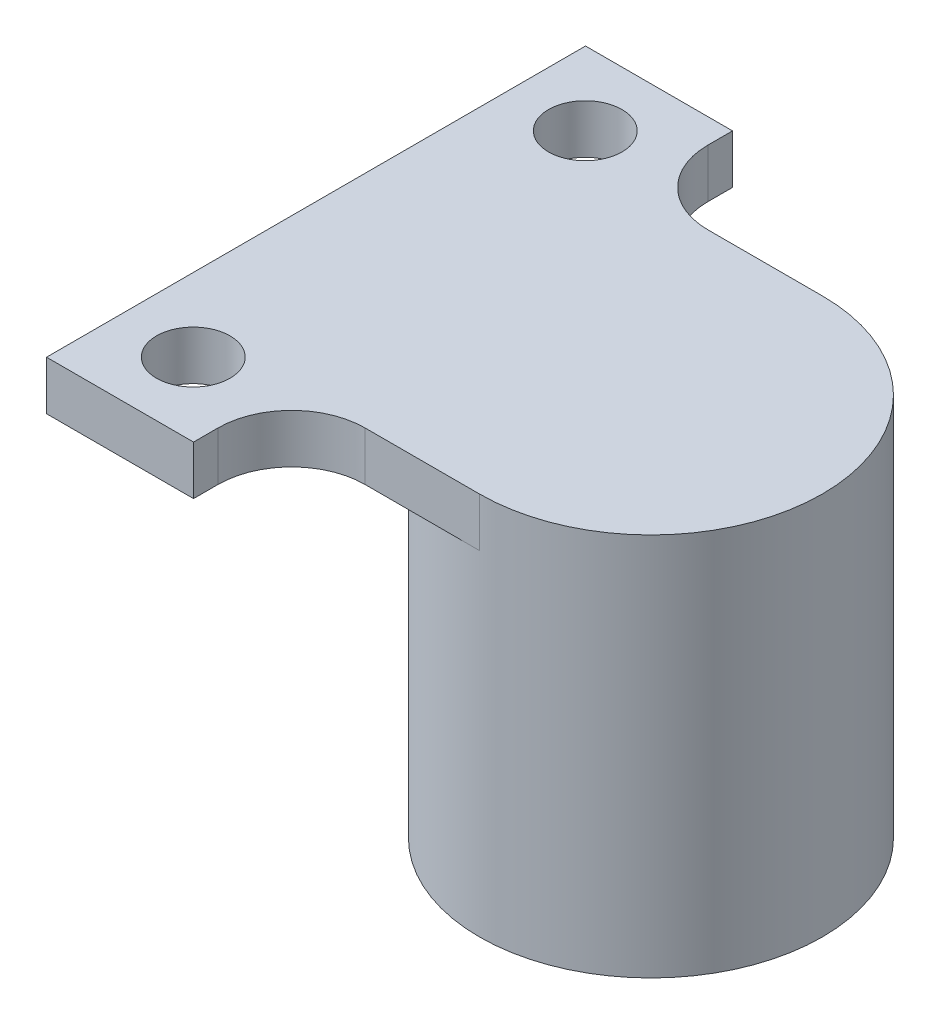
ISO-10303-21;
HEADER;
FILE_DESCRIPTION(('STEP AP214'),'2;1');
FILE_NAME('part.step','',(''),(''),'','','');
FILE_SCHEMA(('AUTOMOTIVE_DESIGN { 1 0 10303 214 1 1 1 1 }'));
ENDSEC;
DATA;
#1=APPLICATION_CONTEXT('core data for automotive mechanical design processes');
#2=APPLICATION_PROTOCOL_DEFINITION('international standard','automotive_design',2000,#1);
#3=PRODUCT_CONTEXT('',#1,'mechanical');
#4=PRODUCT('Part','Part','',(#3));
#5=PRODUCT_RELATED_PRODUCT_CATEGORY('part','',(#4));
#6=PRODUCT_DEFINITION_FORMATION('','',#4);
#7=PRODUCT_DEFINITION_CONTEXT('part definition',#1,'design');
#8=PRODUCT_DEFINITION('design','',#6,#7);
#9=PRODUCT_DEFINITION_SHAPE('','',#8);
#10=(LENGTH_UNIT() NAMED_UNIT(*) SI_UNIT(.MILLI.,.METRE.));
#11=(NAMED_UNIT(*) PLANE_ANGLE_UNIT() SI_UNIT($,.RADIAN.));
#12=(NAMED_UNIT(*) SI_UNIT($,.STERADIAN.) SOLID_ANGLE_UNIT());
#13=UNCERTAINTY_MEASURE_WITH_UNIT(LENGTH_MEASURE(1.E-05),#10,'distance_accuracy_value','');
#14=(GEOMETRIC_REPRESENTATION_CONTEXT(3) GLOBAL_UNCERTAINTY_ASSIGNED_CONTEXT((#13)) GLOBAL_UNIT_ASSIGNED_CONTEXT((#10,
#11,#12)) REPRESENTATION_CONTEXT('',''));
#15=CARTESIAN_POINT('',(0.,0.,0.));
#16=DIRECTION('',(0.,0.,1.));
#17=DIRECTION('',(1.,0.,0.));
#18=AXIS2_PLACEMENT_3D('',#15,#16,#17);
#19=CARTESIAN_POINT('',(0.,15.66,0.));
#20=DIRECTION('',(0.,-1.,0.));
#21=DIRECTION('',(0.,0.,-1.));
#22=AXIS2_PLACEMENT_3D('',#19,#20,#21);
#23=CYLINDRICAL_SURFACE('',#22,5.2);
#24=CARTESIAN_POINT('',(0.,0.,0.));
#25=DIRECTION('',(0.,1.,0.));
#26=DIRECTION('',(0.,0.,1.));
#27=AXIS2_PLACEMENT_3D('',#24,#25,#26);
#28=CIRCLE('',#27,5.2);
#29=CARTESIAN_POINT('',(0.,0.,5.2));
#30=VERTEX_POINT('',#29);
#31=EDGE_CURVE('E160',#30,#30,#28,.T.);
#32=ORIENTED_EDGE('',*,*,#31,.F.);
#33=EDGE_LOOP('',(#32));
#34=FACE_BOUND('',#33,.T.);
#35=CARTESIAN_POINT('',(0.,14.66,0.));
#36=DIRECTION('',(0.,1.,0.));
#37=DIRECTION('',(0.,0.,1.));
#38=AXIS2_PLACEMENT_3D('',#35,#36,#37);
#39=CIRCLE('',#38,5.2);
#40=CARTESIAN_POINT('',(0.,14.66,5.2));
#41=VERTEX_POINT('',#40);
#42=EDGE_CURVE('E421',#41,#41,#39,.T.);
#43=ORIENTED_EDGE('',*,*,#42,.T.);
#44=EDGE_LOOP('',(#43));
#45=FACE_BOUND('',#44,.T.);
#46=ADVANCED_FACE('F36',(#34,#45),#23,.F.);
#47=CARTESIAN_POINT('',(0.,15.66,0.));
#48=DIRECTION('',(0.,1.,0.));
#49=DIRECTION('',(0.,0.,1.));
#50=AXIS2_PLACEMENT_3D('',#47,#48,#49);
#51=PLANE('',#50);
#52=CARTESIAN_POINT('',(0.,15.66,0.));
#53=DIRECTION('',(0.,1.,0.));
#54=DIRECTION('',(0.,0.,1.));
#55=AXIS2_PLACEMENT_3D('',#52,#53,#54);
#56=CIRCLE('',#55,7.);
#57=CARTESIAN_POINT('',(0.,15.66,7.));
#58=VERTEX_POINT('',#57);
#59=CARTESIAN_POINT('',(0.,15.66,-7.));
#60=VERTEX_POINT('',#59);
#61=EDGE_CURVE('E131',#58,#60,#56,.T.);
#62=ORIENTED_EDGE('',*,*,#61,.T.);
#63=DIRECTION('',(1.,0.,0.));
#64=VECTOR('',#63,1.);
#65=CARTESIAN_POINT('',(0.,15.66,-7.));
#66=LINE('',#65,#64);
#67=CARTESIAN_POINT('',(-4.67,15.66,-7.));
#68=VERTEX_POINT('',#67);
#69=EDGE_CURVE('E194',#68,#60,#66,.T.);
#70=ORIENTED_EDGE('',*,*,#69,.F.);
#71=CARTESIAN_POINT('',(-4.67,15.66,-10.));
#72=DIRECTION('',(0.,1.,0.));
#73=DIRECTION('',(0.,0.,1.));
#74=AXIS2_PLACEMENT_3D('',#71,#72,#73);
#75=CIRCLE('',#74,3.);
#76=CARTESIAN_POINT('',(-7.67,15.66,-10.));
#77=VERTEX_POINT('',#76);
#78=EDGE_CURVE('E177',#68,#77,#75,.F.);
#79=ORIENTED_EDGE('',*,*,#78,.T.);
#80=DIRECTION('',(0.,0.,-1.));
#81=VECTOR('',#80,1.);
#82=CARTESIAN_POINT('',(-7.67,15.66,-7.));
#83=LINE('',#82,#81);
#84=CARTESIAN_POINT('',(-7.67,15.66,-11.));
#85=VERTEX_POINT('',#84);
#86=EDGE_CURVE('E146',#77,#85,#83,.T.);
#87=ORIENTED_EDGE('',*,*,#86,.T.);
#88=DIRECTION('',(1.,0.,0.));
#89=VECTOR('',#88,1.);
#90=CARTESIAN_POINT('',(-13.67,15.66,-11.));
#91=LINE('',#90,#89);
#92=CARTESIAN_POINT('',(-13.67,15.66,-11.));
#93=VERTEX_POINT('',#92);
#94=EDGE_CURVE('E149',#93,#85,#91,.T.);
#95=ORIENTED_EDGE('',*,*,#94,.F.);
#96=DIRECTION('',(0.,0.,1.));
#97=VECTOR('',#96,1.);
#98=CARTESIAN_POINT('',(-13.67,15.66,0.));
#99=LINE('',#98,#97);
#100=CARTESIAN_POINT('',(-13.67,15.66,11.));
#101=VERTEX_POINT('',#100);
#102=EDGE_CURVE('E204',#93,#101,#99,.T.);
#103=ORIENTED_EDGE('',*,*,#102,.T.);
#104=DIRECTION('',(1.,0.,0.));
#105=VECTOR('',#104,1.);
#106=CARTESIAN_POINT('',(0.,15.66,11.));
#107=LINE('',#106,#105);
#108=CARTESIAN_POINT('',(-7.67,15.66,11.));
#109=VERTEX_POINT('',#108);
#110=EDGE_CURVE('E206',#101,#109,#107,.T.);
#111=ORIENTED_EDGE('',*,*,#110,.T.);
#112=DIRECTION('',(0.,0.,1.));
#113=VECTOR('',#112,1.);
#114=CARTESIAN_POINT('',(-7.67,15.66,0.));
#115=LINE('',#114,#113);
#116=CARTESIAN_POINT('',(-7.67,15.66,10.));
#117=VERTEX_POINT('',#116);
#118=EDGE_CURVE('E159',#117,#109,#115,.T.);
#119=ORIENTED_EDGE('',*,*,#118,.F.);
#120=CARTESIAN_POINT('',(-4.67,15.66,10.));
#121=DIRECTION('',(0.,1.,0.));
#122=DIRECTION('',(0.,0.,1.));
#123=AXIS2_PLACEMENT_3D('',#120,#121,#122);
#124=CIRCLE('',#123,3.);
#125=CARTESIAN_POINT('',(-4.67,15.66,7.));
#126=VERTEX_POINT('',#125);
#127=EDGE_CURVE('E44',#117,#126,#124,.F.);
#128=ORIENTED_EDGE('',*,*,#127,.T.);
#129=DIRECTION('',(1.,0.,0.));
#130=VECTOR('',#129,1.);
#131=CARTESIAN_POINT('',(0.,15.66,7.));
#132=LINE('',#131,#130);
#133=EDGE_CURVE('E225',#126,#58,#132,.T.);
#134=ORIENTED_EDGE('',*,*,#133,.T.);
#135=EDGE_LOOP('',(#62,#70,#79,#87,#95,#103,#111,#119,#128,#134));
#136=FACE_BOUND('',#135,.T.);
#137=CARTESIAN_POINT('',(-10.68,15.66,8.));
#138=DIRECTION('',(0.,1.,0.));
#139=DIRECTION('',(0.,0.,1.));
#140=AXIS2_PLACEMENT_3D('',#137,#138,#139);
#141=CIRCLE('',#140,1.5);
#142=CARTESIAN_POINT('',(-10.68,15.66,9.50000000000001));
#143=VERTEX_POINT('',#142);
#144=EDGE_CURVE('E415',#143,#143,#141,.T.);
#145=ORIENTED_EDGE('',*,*,#144,.F.);
#146=EDGE_LOOP('',(#145));
#147=FACE_BOUND('',#146,.T.);
#148=CARTESIAN_POINT('',(-10.68,15.66,-8.00000000000001));
#149=DIRECTION('',(0.,1.,0.));
#150=DIRECTION('',(0.,0.,1.));
#151=AXIS2_PLACEMENT_3D('',#148,#149,#150);
#152=CIRCLE('',#151,1.5);
#153=CARTESIAN_POINT('',(-10.68,15.66,-6.50000000000001));
#154=VERTEX_POINT('',#153);
#155=EDGE_CURVE('E152',#154,#154,#152,.F.);
#156=ORIENTED_EDGE('',*,*,#155,.T.);
#157=EDGE_LOOP('',(#156));
#158=FACE_BOUND('',#157,.T.);
#159=ADVANCED_FACE('F191',(#136,#147,#158),#51,.T.);
#160=CARTESIAN_POINT('',(0.,13.66,0.));
#161=DIRECTION('',(0.,1.,0.));
#162=DIRECTION('',(0.,0.,1.));
#163=AXIS2_PLACEMENT_3D('',#160,#161,#162);
#164=PLANE('',#163);
#165=CARTESIAN_POINT('',(-10.68,13.66,8.));
#166=DIRECTION('',(0.,-1.,0.));
#167=DIRECTION('',(0.,0.,-1.));
#168=AXIS2_PLACEMENT_3D('',#165,#166,#167);
#169=CIRCLE('',#168,1.5);
#170=CARTESIAN_POINT('',(-10.68,13.66,6.5));
#171=VERTEX_POINT('',#170);
#172=EDGE_CURVE('E416',#171,#171,#169,.T.);
#173=ORIENTED_EDGE('',*,*,#172,.F.);
#174=EDGE_LOOP('',(#173));
#175=FACE_BOUND('',#174,.T.);
#176=DIRECTION('',(1.,0.,0.));
#177=VECTOR('',#176,1.);
#178=CARTESIAN_POINT('',(0.,13.66,7.));
#179=LINE('',#178,#177);
#180=CARTESIAN_POINT('',(-4.67,13.66,7.));
#181=VERTEX_POINT('',#180);
#182=CARTESIAN_POINT('',(0.,13.66,7.));
#183=VERTEX_POINT('',#182);
#184=EDGE_CURVE('E109',#181,#183,#179,.T.);
#185=ORIENTED_EDGE('',*,*,#184,.F.);
#186=CARTESIAN_POINT('',(-4.67,13.66,10.));
#187=DIRECTION('',(0.,1.,0.));
#188=DIRECTION('',(0.,0.,1.));
#189=AXIS2_PLACEMENT_3D('',#186,#187,#188);
#190=CIRCLE('',#189,3.);
#191=CARTESIAN_POINT('',(-7.67,13.66,10.));
#192=VERTEX_POINT('',#191);
#193=EDGE_CURVE('E11',#181,#192,#190,.T.);
#194=ORIENTED_EDGE('',*,*,#193,.T.);
#195=DIRECTION('',(0.,0.,1.));
#196=VECTOR('',#195,1.);
#197=CARTESIAN_POINT('',(-7.67,13.66,0.));
#198=LINE('',#197,#196);
#199=CARTESIAN_POINT('',(-7.67,13.66,11.));
#200=VERTEX_POINT('',#199);
#201=EDGE_CURVE('E118',#192,#200,#198,.T.);
#202=ORIENTED_EDGE('',*,*,#201,.T.);
#203=DIRECTION('',(1.,0.,0.));
#204=VECTOR('',#203,1.);
#205=CARTESIAN_POINT('',(0.,13.66,11.));
#206=LINE('',#205,#204);
#207=CARTESIAN_POINT('',(-13.67,13.66,11.));
#208=VERTEX_POINT('',#207);
#209=EDGE_CURVE('E133',#208,#200,#206,.T.);
#210=ORIENTED_EDGE('',*,*,#209,.F.);
#211=DIRECTION('',(0.,0.,1.));
#212=VECTOR('',#211,1.);
#213=CARTESIAN_POINT('',(-13.67,13.66,0.));
#214=LINE('',#213,#212);
#215=CARTESIAN_POINT('',(-13.67,13.66,-11.));
#216=VERTEX_POINT('',#215);
#217=EDGE_CURVE('E138',#216,#208,#214,.T.);
#218=ORIENTED_EDGE('',*,*,#217,.F.);
#219=DIRECTION('',(1.,0.,0.));
#220=VECTOR('',#219,1.);
#221=CARTESIAN_POINT('',(-13.67,13.66,-11.));
#222=LINE('',#221,#220);
#223=CARTESIAN_POINT('',(-7.67,13.66,-11.));
#224=VERTEX_POINT('',#223);
#225=EDGE_CURVE('E142',#216,#224,#222,.T.);
#226=ORIENTED_EDGE('',*,*,#225,.T.);
#227=DIRECTION('',(0.,0.,-1.));
#228=VECTOR('',#227,1.);
#229=CARTESIAN_POINT('',(-7.67,13.66,-7.));
#230=LINE('',#229,#228);
#231=CARTESIAN_POINT('',(-7.67,13.66,-10.));
#232=VERTEX_POINT('',#231);
#233=EDGE_CURVE('E145',#232,#224,#230,.T.);
#234=ORIENTED_EDGE('',*,*,#233,.F.);
#235=CARTESIAN_POINT('',(-4.67,13.66,-10.));
#236=DIRECTION('',(0.,1.,0.));
#237=DIRECTION('',(0.,0.,1.));
#238=AXIS2_PLACEMENT_3D('',#235,#236,#237);
#239=CIRCLE('',#238,3.);
#240=CARTESIAN_POINT('',(-4.67,13.66,-7.));
#241=VERTEX_POINT('',#240);
#242=EDGE_CURVE('E179',#232,#241,#239,.T.);
#243=ORIENTED_EDGE('',*,*,#242,.T.);
#244=DIRECTION('',(1.,0.,0.));
#245=VECTOR('',#244,1.);
#246=CARTESIAN_POINT('',(0.,13.66,-7.));
#247=LINE('',#246,#245);
#248=CARTESIAN_POINT('',(0.,13.66,-7.));
#249=VERTEX_POINT('',#248);
#250=EDGE_CURVE('E124',#241,#249,#247,.T.);
#251=ORIENTED_EDGE('',*,*,#250,.T.);
#252=CARTESIAN_POINT('',(0.,13.66,0.));
#253=DIRECTION('',(0.,1.,0.));
#254=DIRECTION('',(0.,0.,1.));
#255=AXIS2_PLACEMENT_3D('',#252,#253,#254);
#256=CIRCLE('',#255,7.);
#257=EDGE_CURVE('E117',#249,#183,#256,.T.);
#258=ORIENTED_EDGE('',*,*,#257,.T.);
#259=EDGE_LOOP('',(#185,#194,#202,#210,#218,#226,#234,#243,#251,#258));
#260=FACE_BOUND('',#259,.T.);
#261=CARTESIAN_POINT('',(-10.68,13.66,-8.00000000000001));
#262=DIRECTION('',(0.,-1.,0.));
#263=DIRECTION('',(0.,0.,-1.));
#264=AXIS2_PLACEMENT_3D('',#261,#262,#263);
#265=CIRCLE('',#264,1.5);
#266=CARTESIAN_POINT('',(-10.68,13.66,-9.50000000000001));
#267=VERTEX_POINT('',#266);
#268=EDGE_CURVE('E414',#267,#267,#265,.F.);
#269=ORIENTED_EDGE('',*,*,#268,.T.);
#270=EDGE_LOOP('',(#269));
#271=FACE_BOUND('',#270,.T.);
#272=ADVANCED_FACE('F121',(#175,#260,#271),#164,.F.);
#273=CARTESIAN_POINT('',(0.,15.66,0.));
#274=DIRECTION('',(0.,-1.,0.));
#275=DIRECTION('',(0.,0.,-1.));
#276=AXIS2_PLACEMENT_3D('',#273,#274,#275);
#277=CYLINDRICAL_SURFACE('',#276,7.);
#278=CARTESIAN_POINT('',(0.,0.,0.));
#279=DIRECTION('',(0.,1.,0.));
#280=DIRECTION('',(0.,0.,1.));
#281=AXIS2_PLACEMENT_3D('',#278,#279,#280);
#282=CIRCLE('',#281,7.);
#283=CARTESIAN_POINT('',(0.,0.,7.));
#284=VERTEX_POINT('',#283);
#285=EDGE_CURVE('E163',#284,#284,#282,.T.);
#286=ORIENTED_EDGE('',*,*,#285,.T.);
#287=EDGE_LOOP('',(#286));
#288=FACE_BOUND('',#287,.T.);
#289=DIRECTION('',(0.,1.,0.));
#290=VECTOR('',#289,1.);
#291=CARTESIAN_POINT('',(0.,13.66,-7.));
#292=LINE('',#291,#290);
#293=EDGE_CURVE('E132',#249,#60,#292,.T.);
#294=ORIENTED_EDGE('',*,*,#293,.T.);
#295=ORIENTED_EDGE('',*,*,#61,.F.);
#296=DIRECTION('',(0.,1.,0.));
#297=VECTOR('',#296,1.);
#298=CARTESIAN_POINT('',(0.,13.66,7.));
#299=LINE('',#298,#297);
#300=EDGE_CURVE('E113',#183,#58,#299,.T.);
#301=ORIENTED_EDGE('',*,*,#300,.F.);
#302=ORIENTED_EDGE('',*,*,#257,.F.);
#303=EDGE_LOOP('',(#294,#295,#301,#302));
#304=FACE_BOUND('',#303,.T.);
#305=ADVANCED_FACE('F129',(#288,#304),#277,.T.);
#306=CARTESIAN_POINT('',(0.,0.,0.));
#307=DIRECTION('',(0.,1.,0.));
#308=DIRECTION('',(0.,0.,1.));
#309=AXIS2_PLACEMENT_3D('',#306,#307,#308);
#310=PLANE('',#309);
#311=ORIENTED_EDGE('',*,*,#285,.F.);
#312=EDGE_LOOP('',(#311));
#313=FACE_BOUND('',#312,.T.);
#314=ORIENTED_EDGE('',*,*,#31,.T.);
#315=EDGE_LOOP('',(#314));
#316=FACE_BOUND('',#315,.T.);
#317=ADVANCED_FACE('F250',(#313,#316),#310,.F.);
#318=CARTESIAN_POINT('',(-7.67,13.66,0.));
#319=DIRECTION('',(-1.,0.,0.));
#320=DIRECTION('',(0.,0.,1.));
#321=AXIS2_PLACEMENT_3D('',#318,#319,#320);
#322=PLANE('',#321);
#323=ORIENTED_EDGE('',*,*,#201,.F.);
#324=DIRECTION('',(0.,1.,0.));
#325=VECTOR('',#324,1.);
#326=CARTESIAN_POINT('',(-7.67,13.66,10.));
#327=LINE('',#326,#325);
#328=EDGE_CURVE('E173',#192,#117,#327,.T.);
#329=ORIENTED_EDGE('',*,*,#328,.T.);
#330=ORIENTED_EDGE('',*,*,#118,.T.);
#331=DIRECTION('',(0.,1.,0.));
#332=VECTOR('',#331,1.);
#333=CARTESIAN_POINT('',(-7.67,13.66,11.));
#334=LINE('',#333,#332);
#335=EDGE_CURVE('E164',#200,#109,#334,.T.);
#336=ORIENTED_EDGE('',*,*,#335,.F.);
#337=EDGE_LOOP('',(#323,#329,#330,#336));
#338=FACE_BOUND('',#337,.T.);
#339=ADVANCED_FACE('F224',(#338),#322,.F.);
#340=CARTESIAN_POINT('',(0.,13.66,11.));
#341=DIRECTION('',(0.,0.,1.));
#342=DIRECTION('',(1.,0.,0.));
#343=AXIS2_PLACEMENT_3D('',#340,#341,#342);
#344=PLANE('',#343);
#345=ORIENTED_EDGE('',*,*,#110,.F.);
#346=DIRECTION('',(0.,1.,0.));
#347=VECTOR('',#346,1.);
#348=CARTESIAN_POINT('',(-13.67,13.66,11.));
#349=LINE('',#348,#347);
#350=EDGE_CURVE('E135',#208,#101,#349,.T.);
#351=ORIENTED_EDGE('',*,*,#350,.F.);
#352=ORIENTED_EDGE('',*,*,#209,.T.);
#353=ORIENTED_EDGE('',*,*,#335,.T.);
#354=EDGE_LOOP('',(#345,#351,#352,#353));
#355=FACE_BOUND('',#354,.T.);
#356=ADVANCED_FACE('F211',(#355),#344,.T.);
#357=CARTESIAN_POINT('',(-13.67,13.66,0.));
#358=DIRECTION('',(-1.,0.,0.));
#359=DIRECTION('',(0.,0.,1.));
#360=AXIS2_PLACEMENT_3D('',#357,#358,#359);
#361=PLANE('',#360);
#362=ORIENTED_EDGE('',*,*,#102,.F.);
#363=DIRECTION('',(0.,1.,0.));
#364=VECTOR('',#363,1.);
#365=CARTESIAN_POINT('',(-13.67,13.66,-11.));
#366=LINE('',#365,#364);
#367=EDGE_CURVE('E156',#216,#93,#366,.T.);
#368=ORIENTED_EDGE('',*,*,#367,.F.);
#369=ORIENTED_EDGE('',*,*,#217,.T.);
#370=ORIENTED_EDGE('',*,*,#350,.T.);
#371=EDGE_LOOP('',(#362,#368,#369,#370));
#372=FACE_BOUND('',#371,.T.);
#373=ADVANCED_FACE('F218',(#372),#361,.T.);
#374=CARTESIAN_POINT('',(0.,13.66,-7.));
#375=DIRECTION('',(0.,0.,1.));
#376=DIRECTION('',(1.,0.,0.));
#377=AXIS2_PLACEMENT_3D('',#374,#375,#376);
#378=PLANE('',#377);
#379=ORIENTED_EDGE('',*,*,#250,.F.);
#380=DIRECTION('',(0.,1.,0.));
#381=VECTOR('',#380,1.);
#382=CARTESIAN_POINT('',(-4.67,13.66,-7.));
#383=LINE('',#382,#381);
#384=EDGE_CURVE('E166',#241,#68,#383,.T.);
#385=ORIENTED_EDGE('',*,*,#384,.T.);
#386=ORIENTED_EDGE('',*,*,#69,.T.);
#387=ORIENTED_EDGE('',*,*,#293,.F.);
#388=EDGE_LOOP('',(#379,#385,#386,#387));
#389=FACE_BOUND('',#388,.T.);
#390=ADVANCED_FACE('F186',(#389),#378,.F.);
#391=CARTESIAN_POINT('',(0.,13.66,7.));
#392=DIRECTION('',(0.,0.,1.));
#393=DIRECTION('',(1.,0.,0.));
#394=AXIS2_PLACEMENT_3D('',#391,#392,#393);
#395=PLANE('',#394);
#396=ORIENTED_EDGE('',*,*,#133,.F.);
#397=DIRECTION('',(0.,1.,0.));
#398=VECTOR('',#397,1.);
#399=CARTESIAN_POINT('',(-4.67,13.66,7.));
#400=LINE('',#399,#398);
#401=EDGE_CURVE('E51',#126,#181,#400,.F.);
#402=ORIENTED_EDGE('',*,*,#401,.T.);
#403=ORIENTED_EDGE('',*,*,#184,.T.);
#404=ORIENTED_EDGE('',*,*,#300,.T.);
#405=EDGE_LOOP('',(#396,#402,#403,#404));
#406=FACE_BOUND('',#405,.T.);
#407=ADVANCED_FACE('F111',(#406),#395,.T.);
#408=CARTESIAN_POINT('',(-13.67,13.66,-11.));
#409=DIRECTION('',(0.,0.,1.));
#410=DIRECTION('',(1.,0.,0.));
#411=AXIS2_PLACEMENT_3D('',#408,#409,#410);
#412=PLANE('',#411);
#413=ORIENTED_EDGE('',*,*,#94,.T.);
#414=DIRECTION('',(0.,1.,0.));
#415=VECTOR('',#414,1.);
#416=CARTESIAN_POINT('',(-7.67,13.66,-11.));
#417=LINE('',#416,#415);
#418=EDGE_CURVE('E148',#224,#85,#417,.T.);
#419=ORIENTED_EDGE('',*,*,#418,.F.);
#420=ORIENTED_EDGE('',*,*,#225,.F.);
#421=ORIENTED_EDGE('',*,*,#367,.T.);
#422=EDGE_LOOP('',(#413,#419,#420,#421));
#423=FACE_BOUND('',#422,.T.);
#424=ADVANCED_FACE('F200',(#423),#412,.F.);
#425=CARTESIAN_POINT('',(-7.67,13.66,-7.));
#426=DIRECTION('',(1.,0.,0.));
#427=DIRECTION('',(0.,0.,-1.));
#428=AXIS2_PLACEMENT_3D('',#425,#426,#427);
#429=PLANE('',#428);
#430=ORIENTED_EDGE('',*,*,#86,.F.);
#431=DIRECTION('',(0.,1.,0.));
#432=VECTOR('',#431,1.);
#433=CARTESIAN_POINT('',(-7.67,13.66,-10.));
#434=LINE('',#433,#432);
#435=EDGE_CURVE('E171',#77,#232,#434,.F.);
#436=ORIENTED_EDGE('',*,*,#435,.T.);
#437=ORIENTED_EDGE('',*,*,#233,.T.);
#438=ORIENTED_EDGE('',*,*,#418,.T.);
#439=EDGE_LOOP('',(#430,#436,#437,#438));
#440=FACE_BOUND('',#439,.T.);
#441=ADVANCED_FACE('F196',(#440),#429,.T.);
#442=CARTESIAN_POINT('',(-10.68,23.66,8.));
#443=DIRECTION('',(0.,-1.,0.));
#444=DIRECTION('',(0.,0.,-1.));
#445=AXIS2_PLACEMENT_3D('',#442,#443,#444);
#446=CYLINDRICAL_SURFACE('',#445,1.5);
#447=ORIENTED_EDGE('',*,*,#144,.T.);
#448=EDGE_LOOP('',(#447));
#449=FACE_BOUND('',#448,.T.);
#450=ORIENTED_EDGE('',*,*,#172,.T.);
#451=EDGE_LOOP('',(#450));
#452=FACE_BOUND('',#451,.T.);
#453=ADVANCED_FACE('F268',(#449,#452),#446,.F.);
#454=CARTESIAN_POINT('',(-10.68,23.66,-8.00000000000001));
#455=DIRECTION('',(0.,-1.,0.));
#456=DIRECTION('',(0.,0.,-1.));
#457=AXIS2_PLACEMENT_3D('',#454,#455,#456);
#458=CYLINDRICAL_SURFACE('',#457,1.5);
#459=ORIENTED_EDGE('',*,*,#155,.F.);
#460=EDGE_LOOP('',(#459));
#461=FACE_BOUND('',#460,.T.);
#462=ORIENTED_EDGE('',*,*,#268,.F.);
#463=EDGE_LOOP('',(#462));
#464=FACE_BOUND('',#463,.T.);
#465=ADVANCED_FACE('F237',(#461,#464),#458,.F.);
#466=CARTESIAN_POINT('',(-4.67,13.66,-10.));
#467=DIRECTION('',(0.,1.,0.));
#468=DIRECTION('',(0.,0.,1.));
#469=AXIS2_PLACEMENT_3D('',#466,#467,#468);
#470=CYLINDRICAL_SURFACE('',#469,3.);
#471=ORIENTED_EDGE('',*,*,#242,.F.);
#472=ORIENTED_EDGE('',*,*,#435,.F.);
#473=ORIENTED_EDGE('',*,*,#78,.F.);
#474=ORIENTED_EDGE('',*,*,#384,.F.);
#475=EDGE_LOOP('',(#471,#472,#473,#474));
#476=FACE_BOUND('',#475,.T.);
#477=ADVANCED_FACE('F189',(#476),#470,.F.);
#478=CARTESIAN_POINT('',(-4.67,13.66,10.));
#479=DIRECTION('',(0.,1.,0.));
#480=DIRECTION('',(0.,0.,1.));
#481=AXIS2_PLACEMENT_3D('',#478,#479,#480);
#482=CYLINDRICAL_SURFACE('',#481,3.);
#483=ORIENTED_EDGE('',*,*,#193,.F.);
#484=ORIENTED_EDGE('',*,*,#401,.F.);
#485=ORIENTED_EDGE('',*,*,#127,.F.);
#486=ORIENTED_EDGE('',*,*,#328,.F.);
#487=EDGE_LOOP('',(#483,#484,#485,#486));
#488=FACE_BOUND('',#487,.T.);
#489=ADVANCED_FACE('F38',(#488),#482,.F.);
#490=CARTESIAN_POINT('',(0.,14.66,0.));
#491=DIRECTION('',(0.,1.,0.));
#492=DIRECTION('',(0.,0.,1.));
#493=AXIS2_PLACEMENT_3D('',#490,#491,#492);
#494=PLANE('',#493);
#495=ORIENTED_EDGE('',*,*,#42,.F.);
#496=EDGE_LOOP('',(#495));
#497=FACE_BOUND('',#496,.T.);
#498=ADVANCED_FACE('F230',(#497),#494,.F.);
#499=CLOSED_SHELL('',(#46,#159,#272,#305,#317,#339,#356,#373,#390,#407,#424,#441,#453,#465,#477,
#489,#498));
#500=MANIFOLD_SOLID_BREP('B2',#499);
#501=ADVANCED_BREP_SHAPE_REPRESENTATION('',(#18,#500),#14);
#502=SHAPE_DEFINITION_REPRESENTATION(#9,#501);
ENDSEC;
END-ISO-10303-21;
